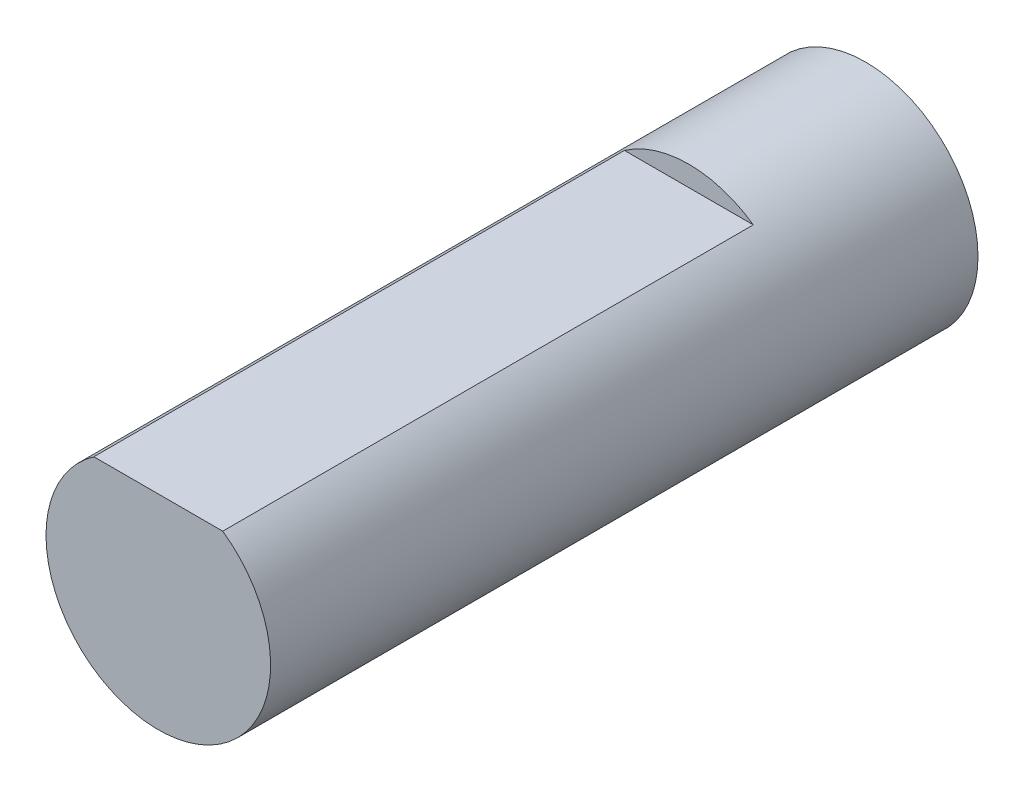
ISO-10303-21;
HEADER;
FILE_DESCRIPTION(('STEP AP214'),'2;1');
FILE_NAME('part.step','',(''),(''),'','','');
FILE_SCHEMA(('AUTOMOTIVE_DESIGN { 1 0 10303 214 1 1 1 1 }'));
ENDSEC;
DATA;
#1=APPLICATION_CONTEXT('core data for automotive mechanical design processes');
#2=APPLICATION_PROTOCOL_DEFINITION('international standard','automotive_design',2000,#1);
#3=PRODUCT_CONTEXT('',#1,'mechanical');
#4=PRODUCT('Part','Part','',(#3));
#5=PRODUCT_RELATED_PRODUCT_CATEGORY('part','',(#4));
#6=PRODUCT_DEFINITION_FORMATION('','',#4);
#7=PRODUCT_DEFINITION_CONTEXT('part definition',#1,'design');
#8=PRODUCT_DEFINITION('design','',#6,#7);
#9=PRODUCT_DEFINITION_SHAPE('','',#8);
#10=(LENGTH_UNIT() NAMED_UNIT(*) SI_UNIT(.MILLI.,.METRE.));
#11=(NAMED_UNIT(*) PLANE_ANGLE_UNIT() SI_UNIT($,.RADIAN.));
#12=(NAMED_UNIT(*) SI_UNIT($,.STERADIAN.) SOLID_ANGLE_UNIT());
#13=UNCERTAINTY_MEASURE_WITH_UNIT(LENGTH_MEASURE(1.E-05),#10,'distance_accuracy_value','');
#14=(GEOMETRIC_REPRESENTATION_CONTEXT(3) GLOBAL_UNCERTAINTY_ASSIGNED_CONTEXT((#13)) GLOBAL_UNIT_ASSIGNED_CONTEXT((#10,
#11,#12)) REPRESENTATION_CONTEXT('',''));
#15=CARTESIAN_POINT('',(0.,0.,0.));
#16=DIRECTION('',(0.,0.,1.));
#17=DIRECTION('',(1.,0.,0.));
#18=AXIS2_PLACEMENT_3D('',#15,#16,#17);
#19=CARTESIAN_POINT('',(0.,0.,5.6));
#20=DIRECTION('',(0.,0.,1.));
#21=DIRECTION('',(1.,0.,0.));
#22=AXIS2_PLACEMENT_3D('',#19,#20,#21);
#23=PLANE('',#22);
#24=DIRECTION('',(1.,0.,0.));
#25=VECTOR('',#24,1.);
#26=CARTESIAN_POINT('',(-1.822258214414,2.6,5.6));
#27=LINE('',#26,#25);
#28=CARTESIAN_POINT('',(-1.82225821441413,2.60000000000005,5.6));
#29=VERTEX_POINT('',#28);
#30=CARTESIAN_POINT('',(1.82225821441413,2.60000000000004,5.6));
#31=VERTEX_POINT('',#30);
#32=EDGE_CURVE('E42',#29,#31,#27,.T.);
#33=ORIENTED_EDGE('',*,*,#32,.T.);
#34=CARTESIAN_POINT('',(0.,0.,5.6));
#35=DIRECTION('',(0.,0.,-1.));
#36=DIRECTION('',(-1.,0.,0.));
#37=AXIS2_PLACEMENT_3D('',#34,#35,#36);
#38=CIRCLE('',#37,3.175);
#39=EDGE_CURVE('E20',#29,#31,#38,.T.);
#40=ORIENTED_EDGE('',*,*,#39,.F.);
#41=EDGE_LOOP('',(#33,#40));
#42=FACE_BOUND('',#41,.T.);
#43=ADVANCED_FACE('F17',(#42),#23,.T.);
#44=CARTESIAN_POINT('',(-1.822258214414,2.6,5.6));
#45=DIRECTION('',(0.,-1.,0.));
#46=DIRECTION('',(0.,0.,-1.));
#47=AXIS2_PLACEMENT_3D('',#44,#45,#46);
#48=PLANE('',#47);
#49=ORIENTED_EDGE('',*,*,#32,.F.);
#50=DIRECTION('',(0.,0.,-1.));
#51=VECTOR('',#50,1.);
#52=CARTESIAN_POINT('',(-1.82225821441406,2.60000000000009,20.6));
#53=LINE('',#52,#51);
#54=CARTESIAN_POINT('',(-1.82225821441413,2.60000000000005,20.6));
#55=VERTEX_POINT('',#54);
#56=EDGE_CURVE('E49',#55,#29,#53,.T.);
#57=ORIENTED_EDGE('',*,*,#56,.F.);
#58=DIRECTION('',(1.,0.,0.));
#59=VECTOR('',#58,1.);
#60=CARTESIAN_POINT('',(0.,2.6,20.6));
#61=LINE('',#60,#59);
#62=CARTESIAN_POINT('',(1.82225821441413,2.60000000000004,20.6));
#63=VERTEX_POINT('',#62);
#64=EDGE_CURVE('E51',#63,#55,#61,.F.);
#65=ORIENTED_EDGE('',*,*,#64,.F.);
#66=DIRECTION('',(0.,0.,-1.));
#67=VECTOR('',#66,1.);
#68=CARTESIAN_POINT('',(1.82225821441406,2.60000000000009,20.6));
#69=LINE('',#68,#67);
#70=EDGE_CURVE('E50',#31,#63,#69,.F.);
#71=ORIENTED_EDGE('',*,*,#70,.F.);
#72=EDGE_LOOP('',(#49,#57,#65,#71));
#73=FACE_BOUND('',#72,.T.);
#74=ADVANCED_FACE('F54',(#73),#48,.F.);
#75=CARTESIAN_POINT('',(0.,0.,20.6));
#76=DIRECTION('',(0.,0.,1.));
#77=DIRECTION('',(1.,0.,0.));
#78=AXIS2_PLACEMENT_3D('',#75,#76,#77);
#79=PLANE('',#78);
#80=CARTESIAN_POINT('',(0.,0.,20.6));
#81=DIRECTION('',(0.,0.,-1.));
#82=DIRECTION('',(-1.,0.,0.));
#83=AXIS2_PLACEMENT_3D('',#80,#81,#82);
#84=CIRCLE('',#83,3.175);
#85=EDGE_CURVE('E26',#63,#55,#84,.T.);
#86=ORIENTED_EDGE('',*,*,#85,.F.);
#87=ORIENTED_EDGE('',*,*,#64,.T.);
#88=EDGE_LOOP('',(#86,#87));
#89=FACE_BOUND('',#88,.T.);
#90=ADVANCED_FACE('F52',(#89),#79,.T.);
#91=CARTESIAN_POINT('',(0.,0.,0.6));
#92=DIRECTION('',(0.,0.,1.));
#93=DIRECTION('',(1.,0.,0.));
#94=AXIS2_PLACEMENT_3D('',#91,#92,#93);
#95=PLANE('',#94);
#96=CARTESIAN_POINT('',(0.,0.,0.6));
#97=DIRECTION('',(0.,0.,-1.));
#98=DIRECTION('',(-1.,0.,0.));
#99=AXIS2_PLACEMENT_3D('',#96,#97,#98);
#100=CIRCLE('',#99,3.175);
#101=CARTESIAN_POINT('',(-3.175,0.,0.6));
#102=VERTEX_POINT('',#101);
#103=EDGE_CURVE('E11',#102,#102,#100,.F.);
#104=ORIENTED_EDGE('',*,*,#103,.F.);
#105=EDGE_LOOP('',(#104));
#106=FACE_BOUND('',#105,.T.);
#107=ADVANCED_FACE('F65',(#106),#95,.F.);
#108=CARTESIAN_POINT('',(0.,0.,20.6));
#109=DIRECTION('',(0.,0.,-1.));
#110=DIRECTION('',(-1.,0.,0.));
#111=AXIS2_PLACEMENT_3D('',#108,#109,#110);
#112=CYLINDRICAL_SURFACE('',#111,3.175);
#113=ORIENTED_EDGE('',*,*,#103,.T.);
#114=EDGE_LOOP('',(#113));
#115=FACE_BOUND('',#114,.T.);
#116=ORIENTED_EDGE('',*,*,#85,.T.);
#117=ORIENTED_EDGE('',*,*,#56,.T.);
#118=ORIENTED_EDGE('',*,*,#39,.T.);
#119=ORIENTED_EDGE('',*,*,#70,.T.);
#120=EDGE_LOOP('',(#116,#117,#118,#119));
#121=FACE_BOUND('',#120,.T.);
#122=ADVANCED_FACE('F47',(#115,#121),#112,.T.);
#123=CLOSED_SHELL('',(#43,#74,#90,#107,#122));
#124=MANIFOLD_SOLID_BREP('B1',#123);
#125=ADVANCED_BREP_SHAPE_REPRESENTATION('',(#18,#124),#14);
#126=SHAPE_DEFINITION_REPRESENTATION(#9,#125);
ENDSEC;
END-ISO-10303-21;
